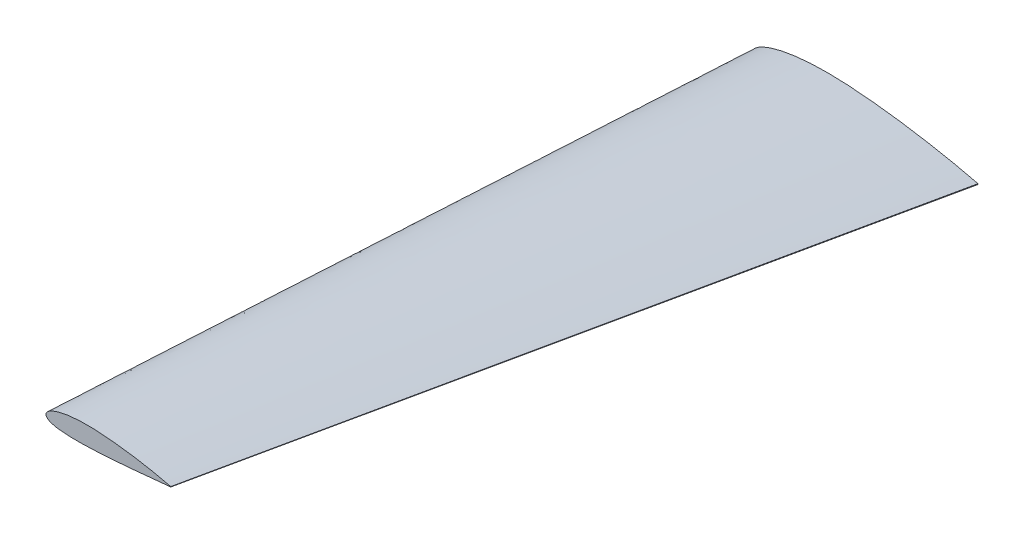
ISO-10303-21;
HEADER;
FILE_DESCRIPTION(('STEP AP214'),'2;1');
FILE_NAME('part.step','',(''),(''),'','','');
FILE_SCHEMA(('AUTOMOTIVE_DESIGN { 1 0 10303 214 1 1 1 1 }'));
ENDSEC;
DATA;
#1=APPLICATION_CONTEXT('core data for automotive mechanical design processes');
#2=APPLICATION_PROTOCOL_DEFINITION('international standard','automotive_design',2000,#1);
#3=PRODUCT_CONTEXT('',#1,'mechanical');
#4=PRODUCT('Part','Part','',(#3));
#5=PRODUCT_RELATED_PRODUCT_CATEGORY('part','',(#4));
#6=PRODUCT_DEFINITION_FORMATION('','',#4);
#7=PRODUCT_DEFINITION_CONTEXT('part definition',#1,'design');
#8=PRODUCT_DEFINITION('design','',#6,#7);
#9=PRODUCT_DEFINITION_SHAPE('','',#8);
#10=(LENGTH_UNIT() NAMED_UNIT(*) SI_UNIT(.MILLI.,.METRE.));
#11=(NAMED_UNIT(*) PLANE_ANGLE_UNIT() SI_UNIT($,.RADIAN.));
#12=(NAMED_UNIT(*) SI_UNIT($,.STERADIAN.) SOLID_ANGLE_UNIT());
#13=UNCERTAINTY_MEASURE_WITH_UNIT(LENGTH_MEASURE(1.E-05),#10,'distance_accuracy_value','');
#14=(GEOMETRIC_REPRESENTATION_CONTEXT(3) GLOBAL_UNCERTAINTY_ASSIGNED_CONTEXT((#13)) GLOBAL_UNIT_ASSIGNED_CONTEXT((#10,
#11,#12)) REPRESENTATION_CONTEXT('',''));
#15=CARTESIAN_POINT('',(0.,0.,0.));
#16=DIRECTION('',(0.,0.,1.));
#17=DIRECTION('',(1.,0.,0.));
#18=AXIS2_PLACEMENT_3D('',#15,#16,#17);
#19=CARTESIAN_POINT('',(123.600731728395,327.697392116665,3643.731));
#20=DIRECTION('',(0.,0.,-1.));
#21=DIRECTION('',(-1.,0.,0.));
#22=AXIS2_PLACEMENT_3D('',#19,#20,#21);
#23=PLANE('',#22);
#24=CARTESIAN_POINT('',(745.17803804139,323.073903560098,3643.731));
#25=CARTESIAN_POINT('',(744.639107288107,323.211523477434,3643.731));
#26=CARTESIAN_POINT('',(742.425848350908,323.776695366635,3643.731));
#27=CARTESIAN_POINT('',(737.423058274674,324.961422426928,3643.731));
#28=CARTESIAN_POINT('',(729.121847656442,326.960316363798,3643.731));
#29=CARTESIAN_POINT('',(717.609469482822,329.636902120137,3643.731));
#30=CARTESIAN_POINT('',(703.011254330986,332.938966729096,3643.731));
#31=CARTESIAN_POINT('',(685.479395783138,336.773270622239,3643.731));
#32=CARTESIAN_POINT('',(665.189067359888,340.999828901714,3643.731));
#33=CARTESIAN_POINT('',(642.360043101413,345.540230698247,3643.731));
#34=CARTESIAN_POINT('',(617.228425855869,350.246884901313,3643.731));
#35=CARTESIAN_POINT('',(590.065732927184,355.016489959447,3643.731));
#36=CARTESIAN_POINT('',(561.159457415949,359.7139125242,3643.731));
#37=CARTESIAN_POINT('',(530.824728559571,364.229563124156,3643.731));
#38=CARTESIAN_POINT('',(499.392097203828,368.437958622711,3643.731));
#39=CARTESIAN_POINT('',(467.207413578438,372.217738439638,3643.731));
#40=CARTESIAN_POINT('',(434.624193064875,375.46920449983,3643.731));
#41=CARTESIAN_POINT('',(401.994197047228,378.052383675852,3643.731));
#42=CARTESIAN_POINT('',(369.589065080489,379.931649811518,3643.731));
#43=CARTESIAN_POINT('',(337.761560330368,380.809487246764,3643.731));
#44=CARTESIAN_POINT('',(306.896109260716,380.568468913844,3643.731));
#45=CARTESIAN_POINT('',(277.453510871779,379.193968876603,3643.731));
#46=CARTESIAN_POINT('',(249.788338665658,376.72880925327,3643.731));
#47=CARTESIAN_POINT('',(224.226349000737,373.211761645437,3643.731));
#48=CARTESIAN_POINT('',(201.062741248409,368.771330151236,3643.731));
#49=CARTESIAN_POINT('',(180.564130557064,363.505029266461,3643.731));
#50=CARTESIAN_POINT('',(162.939926783795,357.600601787976,3643.731));
#51=CARTESIAN_POINT('',(148.374523428498,351.178634573136,3643.731));
#52=CARTESIAN_POINT('',(136.957800184737,344.408278760892,3643.731));
#53=CARTESIAN_POINT('',(128.74183623109,337.363962214321,3643.731));
#54=CARTESIAN_POINT('',(123.719859033771,329.927953003502,3643.731));
#55=CARTESIAN_POINT('',(122.479066313826,322.032977807189,3643.731));
#56=CARTESIAN_POINT('',(125.259268502808,314.558775061369,3643.731));
#57=CARTESIAN_POINT('',(131.560744644463,308.243658314132,3643.731));
#58=CARTESIAN_POINT('',(140.834712413159,302.877489233352,3643.731));
#59=CARTESIAN_POINT('',(153.06146156407,298.268787692712,3643.731));
#60=CARTESIAN_POINT('',(168.166831648293,294.411226217818,3643.731));
#61=CARTESIAN_POINT('',(186.019346419746,291.31654292603,3643.731));
#62=CARTESIAN_POINT('',(206.439800385075,289.008828527253,3643.731));
#63=CARTESIAN_POINT('',(229.218068931063,287.465184533126,3643.731));
#64=CARTESIAN_POINT('',(254.121395007376,286.658819347089,3643.731));
#65=CARTESIAN_POINT('',(280.903332268616,286.52568216366,3643.731));
#66=CARTESIAN_POINT('',(309.296172072258,286.990019699252,3643.731));
#67=CARTESIAN_POINT('',(339.018932585073,287.949569313839,3643.731));
#68=CARTESIAN_POINT('',(369.874141158016,289.270451873705,3643.731));
#69=CARTESIAN_POINT('',(401.551013168679,290.918072669059,3643.731));
#70=CARTESIAN_POINT('',(433.710233849903,292.986198622424,3643.731));
#71=CARTESIAN_POINT('',(465.910977590991,295.318453480645,3643.731));
#72=CARTESIAN_POINT('',(497.800345349033,297.837297839117,3643.731));
#73=CARTESIAN_POINT('',(529.030041046976,300.455954231686,3643.731));
#74=CARTESIAN_POINT('',(559.260279236013,303.080013833382,3643.731));
#75=CARTESIAN_POINT('',(588.155608529977,305.690377404827,3643.731));
#76=CARTESIAN_POINT('',(615.397867494245,308.203463762904,3643.731));
#77=CARTESIAN_POINT('',(640.682061612561,310.596832200104,3643.731));
#78=CARTESIAN_POINT('',(663.722846202263,312.822223165176,3643.731));
#79=CARTESIAN_POINT('',(684.257549972544,314.838037955123,3643.731));
#80=CARTESIAN_POINT('',(702.052062291958,316.629985501275,3643.731));
#81=CARTESIAN_POINT('',(716.90213605089,318.154210010676,3643.731));
#82=CARTESIAN_POINT('',(728.637853714381,319.376522179225,3643.731));
#83=CARTESIAN_POINT('',(737.118923473193,320.263449699161,3643.731));
#84=CARTESIAN_POINT('',(742.268354908525,320.818528984733,3643.731));
#85=CARTESIAN_POINT('',(744.580836743454,321.05862267631,3643.731));
#86=CARTESIAN_POINT('',(745.17803804139,321.120627169522,3643.731));
#87=B_SPLINE_CURVE_WITH_KNOTS('',3,(#24,#25,#26,#27,#28,#29,#30,#31,#32,#33,#34,#35,#36,#37,#38,
#39,#40,#41,#42,#43,#44,#45,#46,#47,#48,#49,#50,#51,#52,#53,#54,#55,#56,#57,#58,#59,#60,#61,#62,
#63,#64,#65,#66,#67,#68,#69,#70,#71,#72,#73,#74,#75,#76,#77,#78,#79,#80,#81,#82,#83,#84,#85,
#86),.UNSPECIFIED.,.F.,.F.,(4,1,1,1,1,1,1,1,1,1,1,1,1,1,1,1,1,1,1,1,1,1,1,1,1,1,1,1,1,1,1,1,1,1,
1,1,1,1,1,1,1,1,1,1,1,1,1,1,1,1,1,1,1,1,1,1,1,1,1,1,4),(0.,0.00130334450771466,
0.00535252230899535,0.0120463391317453,0.0213110944502395,0.0330476223945204,0.0471172151209095,
0.0633625080701345,0.0816121152043148,0.101657457251514,0.123273921483703,0.146232520323734,
0.170277757132092,0.195135791457301,0.220540260457298,0.246208390086661,0.271859817624248,
0.297233649675704,0.32226027454309,0.346452957899317,0.369543630541379,0.391307275518129,
0.411513240657824,0.429980366745658,0.446542667033163,0.461070388848797,0.473485741632755,
0.483779538851851,0.492063936444463,0.498681587764252,0.504376592822902,0.510069862803764,
0.516664638096755,0.524877655219017,0.535024568512073,0.547190470696628,0.561360064127825,
0.577448521055753,0.595323849545366,0.61484313654323,0.635823685513443,0.658074561029986,
0.681378870254446,0.705504985620235,0.730440423602308,0.755703478300476,0.78101527468104,
0.806090940754041,0.830659549821916,0.854449960993451,0.877193251088143,0.898643274073506,
0.918555547337279,0.93670444520541,0.952884105716393,0.96690411005101,0.978611737935814,
0.987863880462776,0.994552223257594,0.998593104909067,1.),.UNSPECIFIED.);
#88=CARTESIAN_POINT('',(745.17803804139,323.073903560098,3643.731));
#89=VERTEX_POINT('',#88);
#90=CARTESIAN_POINT('',(745.17803804139,321.120627169522,3643.731));
#91=VERTEX_POINT('',#90);
#92=EDGE_CURVE('E62',#89,#91,#87,.T.);
#93=ORIENTED_EDGE('',*,*,#92,.T.);
#94=DIRECTION('',(0.,1.,0.));
#95=VECTOR('',#94,1.);
#96=CARTESIAN_POINT('',(745.17803804139,323.073903560098,3643.731));
#97=LINE('',#96,#95);
#98=EDGE_CURVE('E12',#91,#89,#97,.T.);
#99=ORIENTED_EDGE('',*,*,#98,.T.);
#100=EDGE_LOOP('',(#93,#99));
#101=FACE_BOUND('',#100,.T.);
#102=ADVANCED_FACE('F52',(#101),#23,.F.);
#103=CARTESIAN_POINT('',(1.00720168660272,7.45596327957562,0.));
#104=DIRECTION('',(0.,0.,-1.));
#105=DIRECTION('',(-1.,0.,0.));
#106=AXIS2_PLACEMENT_3D('',#103,#104,#105);
#107=PLANE('',#106);
#108=CARTESIAN_POINT('',(1125.6,-0.909113567650333,0.));
#109=CARTESIAN_POINT('',(1124.62493601717,-0.660123834002088,0.));
#110=CARTESIAN_POINT('',(1120.6205828397,0.362417095257306,0.));
#111=CARTESIAN_POINT('',(1111.56925224242,2.50589226148615,0.));
#112=CARTESIAN_POINT('',(1096.55023275163,6.12240416300672,0.));
#113=CARTESIAN_POINT('',(1075.72138740284,10.9650344120117,0.));
#114=CARTESIAN_POINT('',(1049.30947136078,16.9393163574515,0.));
#115=CARTESIAN_POINT('',(1017.5898418574,23.8765557015831,0.));
#116=CARTESIAN_POINT('',(980.879432728162,31.523483854325,0.));
#117=CARTESIAN_POINT('',(939.575871589661,39.7382354386728,0.));
#118=CARTESIAN_POINT('',(894.106329060906,48.2537802746267,0.));
#119=CARTESIAN_POINT('',(844.962049596147,56.8832193559752,0.));
#120=CARTESIAN_POINT('',(792.663181964022,65.3820617900592,0.));
#121=CARTESIAN_POINT('',(737.779875794064,73.5520321104565,0.));
#122=CARTESIAN_POINT('',(680.91018236142,81.1660991332749,0.));
#123=CARTESIAN_POINT('',(622.679833451478,88.0046904366477,0.));
#124=CARTESIAN_POINT('',(563.728429075465,93.8874266274884,0.));
#125=CARTESIAN_POINT('',(504.692395813397,98.5610604114156,0.));
#126=CARTESIAN_POINT('',(446.063199303059,101.96113493283,0.));
#127=CARTESIAN_POINT('',(388.479078604406,103.549368041956,0.));
#128=CARTESIAN_POINT('',(332.635559806205,103.11330405006,0.));
#129=CARTESIAN_POINT('',(279.36634650716,100.626480886692,0.));
#130=CARTESIAN_POINT('',(229.312953130155,96.1663747487469,0.));
#131=CARTESIAN_POINT('',(183.064756492718,89.8031334094592,0.));
#132=CARTESIAN_POINT('',(141.15584798423,81.7692537470844,0.));
#133=CARTESIAN_POINT('',(104.068602802038,72.2411644995865,0.));
#134=CARTESIAN_POINT('',(72.1818970968487,61.5585405475383,0.));
#135=CARTESIAN_POINT('',(45.8293460118377,49.9395544496501,0.));
#136=CARTESIAN_POINT('',(25.1735649692059,37.6902440080706,0.));
#137=CARTESIAN_POINT('',(10.3087785626997,24.9452683198421,0.));
#138=CARTESIAN_POINT('',(1.22273354136559,11.4916201223512,0.));
#139=CARTESIAN_POINT('',(-1.02217878551264,-2.79241527994147,0.));
#140=CARTESIAN_POINT('',(4.00792017052942,-16.3151653799124,0.));
#141=CARTESIAN_POINT('',(15.408907007846,-27.7408315719065,0.));
#142=CARTESIAN_POINT('',(32.1878937220337,-37.449608004839,0.));
#143=CARTESIAN_POINT('',(54.3092194239966,-45.787931346987,0.));
#144=CARTESIAN_POINT('',(81.6387088375333,-52.7672496226981,0.));
#145=CARTESIAN_POINT('',(113.93848770631,-58.366325566523,0.));
#146=CARTESIAN_POINT('',(150.88432732185,-62.5415729043384,0.));
#147=CARTESIAN_POINT('',(192.096058356265,-65.3344208756585,0.));
#148=CARTESIAN_POINT('',(237.152563597094,-66.7933423514224,0.));
#149=CARTESIAN_POINT('',(285.607958385438,-67.0342216694907,0.));
#150=CARTESIAN_POINT('',(336.977889112546,-66.1941159526169,0.));
#151=CARTESIAN_POINT('',(390.753987562759,-64.4580445497038,0.));
#152=CARTESIAN_POINT('',(446.578975056939,-62.0682291572253,0.));
#153=CARTESIAN_POINT('',(503.89056248859,-59.0872604796566,0.));
#154=CARTESIAN_POINT('',(562.074842400613,-55.3454901004323,0.));
#155=CARTESIAN_POINT('',(620.334248179703,-51.1258427762017,0.));
#156=CARTESIAN_POINT('',(678.030294929199,-46.5686071808204,0.));
#157=CARTESIAN_POINT('',(734.532825698464,-41.8307860113055,0.));
#158=CARTESIAN_POINT('',(789.22708144655,-37.0831890504113,0.));
#159=CARTESIAN_POINT('',(841.506144563638,-32.3603717216383,0.));
#160=CARTESIAN_POINT('',(890.794379397579,-27.8135538260544,0.));
#161=CARTESIAN_POINT('',(936.539972629226,-23.483336360183,0.));
#162=CARTESIAN_POINT('',(978.226662529099,-19.4570332321028,0.));
#163=CARTESIAN_POINT('',(1015.37920934993,-15.8099071667154,0.));
#164=CARTESIAN_POINT('',(1047.57404690378,-12.5678143732826,0.));
#165=CARTESIAN_POINT('',(1074.44163977454,-9.81010123144939,0.));
#166=CARTESIAN_POINT('',(1095.67456355306,-7.59862496280062,0.));
#167=CARTESIAN_POINT('',(1111.01899436783,-5.99394555862073,0.));
#168=CARTESIAN_POINT('',(1120.33563680115,-4.989664738349,0.));
#169=CARTESIAN_POINT('',(1124.51950965394,-4.5552736598356,0.));
#170=CARTESIAN_POINT('',(1125.6,-4.44309162580532,0.));
#171=B_SPLINE_CURVE_WITH_KNOTS('',3,(#108,#109,#110,#111,#112,#113,#114,#115,#116,#117,#118,
#119,#120,#121,#122,#123,#124,#125,#126,#127,#128,#129,#130,#131,#132,#133,#134,#135,#136,#137,
#138,#139,#140,#141,#142,#143,#144,#145,#146,#147,#148,#149,#150,#151,#152,#153,#154,#155,#156,
#157,#158,#159,#160,#161,#162,#163,#164,#165,#166,#167,#168,#169,#170),.UNSPECIFIED.,.F.,.F.,(4,
1,1,1,1,1,1,1,1,1,1,1,1,1,1,1,1,1,1,1,1,1,1,1,1,1,1,1,1,1,1,1,1,1,1,1,1,1,1,1,1,1,1,1,1,1,1,1,1,
1,1,1,1,1,1,1,1,1,1,1,4),(0.,0.00130334450771466,0.00535252230899535,0.0120463391317453,
0.0213110944502395,0.0330476223945204,0.0471172151209095,0.0633625080701345,0.0816121152043148,
0.101657457251514,0.123273921483703,0.146232520323734,0.170277757132092,0.195135791457301,
0.220540260457298,0.246208390086661,0.271859817624248,0.297233649675704,0.32226027454309,
0.346452957899317,0.369543630541379,0.391307275518129,0.411513240657824,0.429980366745658,
0.446542667033163,0.461070388848797,0.473485741632755,0.483779538851851,0.492063936444463,
0.498681587764252,0.504376592822902,0.510069862803764,0.516664638096755,0.524877655219017,
0.535024568512073,0.547190470696628,0.561360064127825,0.577448521055753,0.595323849545366,
0.61484313654323,0.635823685513443,0.658074561029986,0.681378870254446,0.705504985620235,
0.730440423602308,0.755703478300476,0.78101527468104,0.806090940754041,0.830659549821916,
0.854449960993451,0.877193251088143,0.898643274073506,0.918555547337279,0.93670444520541,
0.952884105716393,0.96690411005101,0.978611737935814,0.987863880462776,0.994552223257594,
0.998593104909067,1.),.UNSPECIFIED.);
#172=CARTESIAN_POINT('',(1125.6,-0.909113567650291,0.));
#173=VERTEX_POINT('',#172);
#174=CARTESIAN_POINT('',(0.,0.,0.));
#175=VERTEX_POINT('',#174);
#176=EDGE_CURVE('E89',#173,#175,#171,.T.);
#177=ORIENTED_EDGE('',*,*,#176,.F.);
#178=DIRECTION('',(0.,1.,0.));
#179=VECTOR('',#178,1.);
#180=CARTESIAN_POINT('',(1125.6,-0.909113567650291,0.));
#181=LINE('',#180,#179);
#182=CARTESIAN_POINT('',(1125.6,-4.44309162580532,0.));
#183=VERTEX_POINT('',#182);
#184=EDGE_CURVE('E94',#183,#173,#181,.T.);
#185=ORIENTED_EDGE('',*,*,#184,.F.);
#186=EDGE_CURVE('E105',#175,#183,#171,.T.);
#187=ORIENTED_EDGE('',*,*,#186,.F.);
#188=EDGE_LOOP('',(#177,#185,#187));
#189=FACE_BOUND('',#188,.T.);
#190=ADVANCED_FACE('F104',(#189),#107,.T.);
#191=CARTESIAN_POINT('',(1113.46291747164,0.,116.250554070187));
#192=DIRECTION('',(-0.994594004107241,0.,-0.103840103013847));
#193=DIRECTION('',(-0.103840103013847,0.,0.994594004107241));
#194=AXIS2_PLACEMENT_3D('',#191,#192,#193);
#195=PLANE('',#194);
#196=DIRECTION('',(-0.103436420073089,0.0880907171700532,0.990727476428775));
#197=VECTOR('',#196,1.);
#198=CARTESIAN_POINT('',(1125.6,-0.909113567650291,0.));
#199=LINE('',#198,#197);
#200=EDGE_CURVE('E85',#173,#89,#199,.T.);
#201=ORIENTED_EDGE('',*,*,#200,.T.);
#202=ORIENTED_EDGE('',*,*,#98,.F.);
#203=DIRECTION('',(-0.103432494574019,0.0885171492319334,0.990689877488433));
#204=VECTOR('',#203,1.);
#205=CARTESIAN_POINT('',(1125.6,-4.44309162580532,0.));
#206=LINE('',#205,#204);
#207=EDGE_CURVE('E70',#183,#91,#206,.T.);
#208=ORIENTED_EDGE('',*,*,#207,.F.);
#209=ORIENTED_EDGE('',*,*,#184,.T.);
#210=EDGE_LOOP('',(#201,#202,#208,#209));
#211=FACE_BOUND('',#210,.T.);
#212=ADVANCED_FACE('F97',(#211),#195,.F.);
#213=CARTESIAN_POINT('',(1125.6,-0.909113567650333,0.));
#214=CARTESIAN_POINT('',(745.17803804139,323.073903560098,3643.731));
#215=CARTESIAN_POINT('',(1124.62493601717,-0.660123834002088,0.));
#216=CARTESIAN_POINT('',(744.639107288107,323.211523477434,3643.731));
#217=CARTESIAN_POINT('',(1120.6205828397,0.362417095257306,0.));
#218=CARTESIAN_POINT('',(742.425848350908,323.776695366635,3643.731));
#219=CARTESIAN_POINT('',(1111.56925224242,2.50589226148615,0.));
#220=CARTESIAN_POINT('',(737.423058274674,324.961422426928,3643.731));
#221=CARTESIAN_POINT('',(1096.55023275163,6.12240416300672,0.));
#222=CARTESIAN_POINT('',(729.121847656442,326.960316363798,3643.731));
#223=CARTESIAN_POINT('',(1075.72138740284,10.9650344120117,0.));
#224=CARTESIAN_POINT('',(717.609469482822,329.636902120137,3643.731));
#225=CARTESIAN_POINT('',(1049.30947136078,16.9393163574515,0.));
#226=CARTESIAN_POINT('',(703.011254330986,332.938966729096,3643.731));
#227=CARTESIAN_POINT('',(1017.5898418574,23.8765557015831,0.));
#228=CARTESIAN_POINT('',(685.479395783138,336.773270622239,3643.731));
#229=CARTESIAN_POINT('',(980.879432728162,31.523483854325,0.));
#230=CARTESIAN_POINT('',(665.189067359888,340.999828901714,3643.731));
#231=CARTESIAN_POINT('',(939.575871589661,39.7382354386728,0.));
#232=CARTESIAN_POINT('',(642.360043101413,345.540230698247,3643.731));
#233=CARTESIAN_POINT('',(894.106329060906,48.2537802746267,0.));
#234=CARTESIAN_POINT('',(617.228425855869,350.246884901313,3643.731));
#235=CARTESIAN_POINT('',(844.962049596147,56.8832193559752,0.));
#236=CARTESIAN_POINT('',(590.065732927184,355.016489959447,3643.731));
#237=CARTESIAN_POINT('',(792.663181964022,65.3820617900592,0.));
#238=CARTESIAN_POINT('',(561.159457415949,359.7139125242,3643.731));
#239=CARTESIAN_POINT('',(737.779875794064,73.5520321104565,0.));
#240=CARTESIAN_POINT('',(530.824728559571,364.229563124156,3643.731));
#241=CARTESIAN_POINT('',(680.91018236142,81.1660991332749,0.));
#242=CARTESIAN_POINT('',(499.392097203828,368.437958622711,3643.731));
#243=CARTESIAN_POINT('',(622.679833451478,88.0046904366477,0.));
#244=CARTESIAN_POINT('',(467.207413578438,372.217738439638,3643.731));
#245=CARTESIAN_POINT('',(563.728429075465,93.8874266274884,0.));
#246=CARTESIAN_POINT('',(434.624193064875,375.46920449983,3643.731));
#247=CARTESIAN_POINT('',(504.692395813397,98.5610604114156,0.));
#248=CARTESIAN_POINT('',(401.994197047228,378.052383675852,3643.731));
#249=CARTESIAN_POINT('',(446.063199303059,101.96113493283,0.));
#250=CARTESIAN_POINT('',(369.589065080489,379.931649811518,3643.731));
#251=CARTESIAN_POINT('',(388.479078604406,103.549368041956,0.));
#252=CARTESIAN_POINT('',(337.761560330368,380.809487246764,3643.731));
#253=CARTESIAN_POINT('',(332.635559806205,103.11330405006,0.));
#254=CARTESIAN_POINT('',(306.896109260716,380.568468913844,3643.731));
#255=CARTESIAN_POINT('',(279.36634650716,100.626480886692,0.));
#256=CARTESIAN_POINT('',(277.453510871779,379.193968876603,3643.731));
#257=CARTESIAN_POINT('',(229.312953130155,96.1663747487469,0.));
#258=CARTESIAN_POINT('',(249.788338665658,376.72880925327,3643.731));
#259=CARTESIAN_POINT('',(183.064756492718,89.8031334094592,0.));
#260=CARTESIAN_POINT('',(224.226349000737,373.211761645437,3643.731));
#261=CARTESIAN_POINT('',(141.15584798423,81.7692537470844,0.));
#262=CARTESIAN_POINT('',(201.062741248409,368.771330151236,3643.731));
#263=CARTESIAN_POINT('',(104.068602802038,72.2411644995865,0.));
#264=CARTESIAN_POINT('',(180.564130557064,363.505029266461,3643.731));
#265=CARTESIAN_POINT('',(72.1818970968487,61.5585405475383,0.));
#266=CARTESIAN_POINT('',(162.939926783795,357.600601787976,3643.731));
#267=CARTESIAN_POINT('',(45.8293460118377,49.9395544496501,0.));
#268=CARTESIAN_POINT('',(148.374523428498,351.178634573136,3643.731));
#269=CARTESIAN_POINT('',(25.1735649692059,37.6902440080706,0.));
#270=CARTESIAN_POINT('',(136.957800184737,344.408278760892,3643.731));
#271=CARTESIAN_POINT('',(10.3087785626997,24.9452683198421,0.));
#272=CARTESIAN_POINT('',(128.74183623109,337.363962214321,3643.731));
#273=CARTESIAN_POINT('',(1.22273354136559,11.4916201223512,0.));
#274=CARTESIAN_POINT('',(123.719859033771,329.927953003502,3643.731));
#275=CARTESIAN_POINT('',(-1.02217878551264,-2.79241527994147,0.));
#276=CARTESIAN_POINT('',(122.479066313826,322.032977807189,3643.731));
#277=CARTESIAN_POINT('',(4.00792017052942,-16.3151653799124,0.));
#278=CARTESIAN_POINT('',(125.259268502808,314.558775061369,3643.731));
#279=CARTESIAN_POINT('',(15.408907007846,-27.7408315719065,0.));
#280=CARTESIAN_POINT('',(131.560744644463,308.243658314132,3643.731));
#281=CARTESIAN_POINT('',(32.1878937220337,-37.449608004839,0.));
#282=CARTESIAN_POINT('',(140.834712413159,302.877489233352,3643.731));
#283=CARTESIAN_POINT('',(54.3092194239966,-45.787931346987,0.));
#284=CARTESIAN_POINT('',(153.06146156407,298.268787692712,3643.731));
#285=CARTESIAN_POINT('',(81.6387088375333,-52.7672496226981,0.));
#286=CARTESIAN_POINT('',(168.166831648293,294.411226217818,3643.731));
#287=CARTESIAN_POINT('',(113.93848770631,-58.366325566523,0.));
#288=CARTESIAN_POINT('',(186.019346419746,291.31654292603,3643.731));
#289=CARTESIAN_POINT('',(150.88432732185,-62.5415729043384,0.));
#290=CARTESIAN_POINT('',(206.439800385075,289.008828527253,3643.731));
#291=CARTESIAN_POINT('',(192.096058356265,-65.3344208756585,0.));
#292=CARTESIAN_POINT('',(229.218068931063,287.465184533126,3643.731));
#293=CARTESIAN_POINT('',(237.152563597094,-66.7933423514224,0.));
#294=CARTESIAN_POINT('',(254.121395007376,286.658819347089,3643.731));
#295=CARTESIAN_POINT('',(285.607958385438,-67.0342216694907,0.));
#296=CARTESIAN_POINT('',(280.903332268616,286.52568216366,3643.731));
#297=CARTESIAN_POINT('',(336.977889112546,-66.1941159526169,0.));
#298=CARTESIAN_POINT('',(309.296172072258,286.990019699252,3643.731));
#299=CARTESIAN_POINT('',(390.753987562759,-64.4580445497038,0.));
#300=CARTESIAN_POINT('',(339.018932585073,287.949569313839,3643.731));
#301=CARTESIAN_POINT('',(446.578975056939,-62.0682291572253,0.));
#302=CARTESIAN_POINT('',(369.874141158016,289.270451873705,3643.731));
#303=CARTESIAN_POINT('',(503.89056248859,-59.0872604796566,0.));
#304=CARTESIAN_POINT('',(401.551013168679,290.918072669059,3643.731));
#305=CARTESIAN_POINT('',(562.074842400613,-55.3454901004323,0.));
#306=CARTESIAN_POINT('',(433.710233849903,292.986198622424,3643.731));
#307=CARTESIAN_POINT('',(620.334248179703,-51.1258427762017,0.));
#308=CARTESIAN_POINT('',(465.910977590991,295.318453480645,3643.731));
#309=CARTESIAN_POINT('',(678.030294929199,-46.5686071808204,0.));
#310=CARTESIAN_POINT('',(497.800345349033,297.837297839117,3643.731));
#311=CARTESIAN_POINT('',(734.532825698464,-41.8307860113055,0.));
#312=CARTESIAN_POINT('',(529.030041046976,300.455954231686,3643.731));
#313=CARTESIAN_POINT('',(789.22708144655,-37.0831890504113,0.));
#314=CARTESIAN_POINT('',(559.260279236013,303.080013833382,3643.731));
#315=CARTESIAN_POINT('',(841.506144563638,-32.3603717216383,0.));
#316=CARTESIAN_POINT('',(588.155608529977,305.690377404827,3643.731));
#317=CARTESIAN_POINT('',(890.794379397579,-27.8135538260544,0.));
#318=CARTESIAN_POINT('',(615.397867494245,308.203463762904,3643.731));
#319=CARTESIAN_POINT('',(936.539972629226,-23.483336360183,0.));
#320=CARTESIAN_POINT('',(640.682061612561,310.596832200104,3643.731));
#321=CARTESIAN_POINT('',(978.226662529099,-19.4570332321028,0.));
#322=CARTESIAN_POINT('',(663.722846202263,312.822223165176,3643.731));
#323=CARTESIAN_POINT('',(1015.37920934993,-15.8099071667154,0.));
#324=CARTESIAN_POINT('',(684.257549972544,314.838037955123,3643.731));
#325=CARTESIAN_POINT('',(1047.57404690378,-12.5678143732826,0.));
#326=CARTESIAN_POINT('',(702.052062291958,316.629985501275,3643.731));
#327=CARTESIAN_POINT('',(1074.44163977454,-9.81010123144939,0.));
#328=CARTESIAN_POINT('',(716.90213605089,318.154210010676,3643.731));
#329=CARTESIAN_POINT('',(1095.67456355306,-7.59862496280062,0.));
#330=CARTESIAN_POINT('',(728.637853714381,319.376522179225,3643.731));
#331=CARTESIAN_POINT('',(1111.01899436783,-5.99394555862073,0.));
#332=CARTESIAN_POINT('',(737.118923473193,320.263449699161,3643.731));
#333=CARTESIAN_POINT('',(1120.33563680115,-4.989664738349,0.));
#334=CARTESIAN_POINT('',(742.268354908525,320.818528984733,3643.731));
#335=CARTESIAN_POINT('',(1124.51950965394,-4.5552736598356,0.));
#336=CARTESIAN_POINT('',(744.580836743454,321.05862267631,3643.731));
#337=CARTESIAN_POINT('',(1125.6,-4.44309162580532,0.));
#338=CARTESIAN_POINT('',(745.17803804139,321.120627169522,3643.731));
#339=B_SPLINE_SURFACE_WITH_KNOTS('',3,1,((#213,#214),(#215,#216),(#217,#218),(#219,#220),(#221,
#222),(#223,#224),(#225,#226),(#227,#228),(#229,#230),(#231,#232),(#233,#234),(#235,#236),(#237,
#238),(#239,#240),(#241,#242),(#243,#244),(#245,#246),(#247,#248),(#249,#250),(#251,#252),(#253,
#254),(#255,#256),(#257,#258),(#259,#260),(#261,#262),(#263,#264),(#265,#266),(#267,#268),(#269,
#270),(#271,#272),(#273,#274),(#275,#276),(#277,#278),(#279,#280),(#281,#282),(#283,#284),(#285,
#286),(#287,#288),(#289,#290),(#291,#292),(#293,#294),(#295,#296),(#297,#298),(#299,#300),(#301,
#302),(#303,#304),(#305,#306),(#307,#308),(#309,#310),(#311,#312),(#313,#314),(#315,#316),(#317,
#318),(#319,#320),(#321,#322),(#323,#324),(#325,#326),(#327,#328),(#329,#330),(#331,#332),(#333,
#334),(#335,#336),(#337,#338)),.UNSPECIFIED.,.F.,.F.,.F.,(4,1,1,1,1,1,1,1,1,1,1,1,1,1,1,1,1,1,1,
1,1,1,1,1,1,1,1,1,1,1,1,1,1,1,1,1,1,1,1,1,1,1,1,1,1,1,1,1,1,1,1,1,1,1,1,1,1,1,1,1,4),(2,2),(0.,
0.00130334450771466,0.00535252230899535,0.0120463391317453,0.0213110944502395,
0.0330476223945204,0.0471172151209095,0.0633625080701345,0.0816121152043148,0.101657457251514,
0.123273921483703,0.146232520323734,0.170277757132092,0.195135791457301,0.220540260457298,
0.246208390086661,0.271859817624248,0.297233649675704,0.32226027454309,0.346452957899317,
0.369543630541379,0.391307275518129,0.411513240657824,0.429980366745658,0.446542667033163,
0.461070388848797,0.473485741632755,0.483779538851851,0.492063936444463,0.498681587764252,
0.504376592822902,0.510069862803764,0.516664638096755,0.524877655219017,0.535024568512073,
0.547190470696628,0.561360064127825,0.577448521055753,0.595323849545366,0.61484313654323,
0.635823685513443,0.658074561029986,0.681378870254446,0.705504985620235,0.730440423602308,
0.755703478300476,0.78101527468104,0.806090940754041,0.830659549821916,0.854449960993451,
0.877193251088143,0.898643274073507,0.918555547337279,0.936704445205411,0.952884105716393,
0.966904110051011,0.978611737935814,0.987863880462776,0.994552223257594,0.998593104909067,1.),
(0.,1.),.UNSPECIFIED.);
#340=ORIENTED_EDGE('',*,*,#176,.T.);
#341=ORIENTED_EDGE('',*,*,#186,.T.);
#342=ORIENTED_EDGE('',*,*,#207,.T.);
#343=ORIENTED_EDGE('',*,*,#92,.F.);
#344=ORIENTED_EDGE('',*,*,#200,.F.);
#345=EDGE_LOOP('',(#340,#341,#342,#343,#344));
#346=FACE_BOUND('',#345,.T.);
#347=ADVANCED_FACE('F87',(#346),#339,.T.);
#348=CLOSED_SHELL('',(#102,#190,#212,#347));
#349=MANIFOLD_SOLID_BREP('B2',#348);
#350=ADVANCED_BREP_SHAPE_REPRESENTATION('',(#18,#349),#14);
#351=SHAPE_DEFINITION_REPRESENTATION(#9,#350);
ENDSEC;
END-ISO-10303-21;
